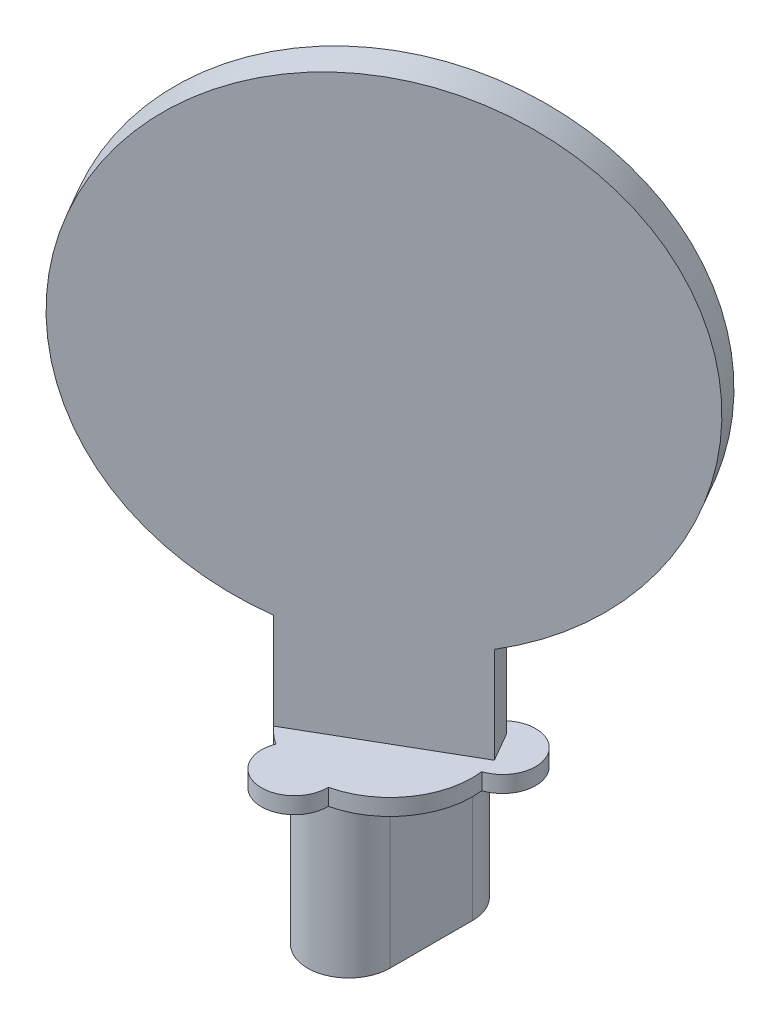
ISO-10303-21;
HEADER;
FILE_DESCRIPTION(('STEP AP214'),'2;1');
FILE_NAME('part.step','',(''),(''),'','','');
FILE_SCHEMA(('AUTOMOTIVE_DESIGN { 1 0 10303 214 1 1 1 1 }'));
ENDSEC;
DATA;
#1=APPLICATION_CONTEXT('core data for automotive mechanical design processes');
#2=APPLICATION_PROTOCOL_DEFINITION('international standard','automotive_design',2000,#1);
#3=PRODUCT_CONTEXT('',#1,'mechanical');
#4=PRODUCT('Part','Part','',(#3));
#5=PRODUCT_RELATED_PRODUCT_CATEGORY('part','',(#4));
#6=PRODUCT_DEFINITION_FORMATION('','',#4);
#7=PRODUCT_DEFINITION_CONTEXT('part definition',#1,'design');
#8=PRODUCT_DEFINITION('design','',#6,#7);
#9=PRODUCT_DEFINITION_SHAPE('','',#8);
#10=(LENGTH_UNIT() NAMED_UNIT(*) SI_UNIT(.MILLI.,.METRE.));
#11=(NAMED_UNIT(*) PLANE_ANGLE_UNIT() SI_UNIT($,.RADIAN.));
#12=(NAMED_UNIT(*) SI_UNIT($,.STERADIAN.) SOLID_ANGLE_UNIT());
#13=UNCERTAINTY_MEASURE_WITH_UNIT(LENGTH_MEASURE(1.E-05),#10,'distance_accuracy_value','');
#14=(GEOMETRIC_REPRESENTATION_CONTEXT(3) GLOBAL_UNCERTAINTY_ASSIGNED_CONTEXT((#13)) GLOBAL_UNIT_ASSIGNED_CONTEXT((#10,
#11,#12)) REPRESENTATION_CONTEXT('',''));
#15=CARTESIAN_POINT('',(0.,0.,0.));
#16=DIRECTION('',(0.,0.,1.));
#17=DIRECTION('',(1.,0.,0.));
#18=AXIS2_PLACEMENT_3D('',#15,#16,#17);
#19=CARTESIAN_POINT('',(0.,0.,-2.5));
#20=DIRECTION('',(0.,1.,0.));
#21=DIRECTION('',(0.,0.,1.));
#22=AXIS2_PLACEMENT_3D('',#19,#20,#21);
#23=PLANE('',#22);
#24=DIRECTION('',(-0.866025403784438,0.,0.5));
#25=VECTOR('',#24,1.);
#26=CARTESIAN_POINT('',(3.74264068711928,0.,-3.31551514656762));
#27=LINE('',#26,#25);
#28=CARTESIAN_POINT('',(3.74264068711928,0.,-3.31551514656762));
#29=VERTEX_POINT('',#28);
#30=CARTESIAN_POINT('',(-4.74264068711928,0.,1.58346433899874));
#31=VERTEX_POINT('',#30);
#32=EDGE_CURVE('E186',#29,#31,#27,.T.);
#33=ORIENTED_EDGE('',*,*,#32,.F.);
#34=DIRECTION('',(0.5,0.,0.866025403784439));
#35=VECTOR('',#34,1.);
#36=CARTESIAN_POINT('',(3.74264068711928,0.,-3.31551514656762));
#37=LINE('',#36,#35);
#38=CARTESIAN_POINT('',(4.74264068711929,0.,-1.58346433899874));
#39=VERTEX_POINT('',#38);
#40=EDGE_CURVE('E481',#29,#39,#37,.T.);
#41=ORIENTED_EDGE('',*,*,#40,.T.);
#42=DIRECTION('',(-0.866025403784439,0.,0.5));
#43=VECTOR('',#42,1.);
#44=CARTESIAN_POINT('',(4.74264068711929,0.,-1.58346433899874));
#45=LINE('',#44,#43);
#46=CARTESIAN_POINT('',(-3.74264068711928,0.,3.31551514656762));
#47=VERTEX_POINT('',#46);
#48=EDGE_CURVE('E202',#39,#47,#45,.T.);
#49=ORIENTED_EDGE('',*,*,#48,.T.);
#50=CARTESIAN_POINT('',(0.,0.,0.));
#51=DIRECTION('',(0.,1.,0.));
#52=DIRECTION('',(0.,0.,1.));
#53=AXIS2_PLACEMENT_3D('',#50,#51,#52);
#54=CIRCLE('',#53,5.);
#55=CARTESIAN_POINT('',(-2.72860280896128,0.,4.18983611981765));
#56=VERTEX_POINT('',#55);
#57=EDGE_CURVE('E199',#47,#56,#54,.T.);
#58=ORIENTED_EDGE('',*,*,#57,.T.);
#59=CARTESIAN_POINT('',(-0.86824088833465,0.,4.92403876506104));
#60=DIRECTION('',(0.,1.,0.));
#61=DIRECTION('',(0.,0.,1.));
#62=AXIS2_PLACEMENT_3D('',#59,#60,#61);
#63=CIRCLE('',#62,2.);
#64=CARTESIAN_POINT('',(1.13103957442552,0.,4.87039520789467));
#65=VERTEX_POINT('',#64);
#66=EDGE_CURVE('E216',#56,#65,#63,.T.);
#67=ORIENTED_EDGE('',*,*,#66,.T.);
#68=CARTESIAN_POINT('',(4.96351275452169,0.,-0.602943725152275));
#69=VERTEX_POINT('',#68);
#70=EDGE_CURVE('E193',#65,#69,#54,.T.);
#71=ORIENTED_EDGE('',*,*,#70,.T.);
#72=CARTESIAN_POINT('',(4.3301270189222,0.,-2.49999999999999));
#73=DIRECTION('',(0.,1.,0.));
#74=DIRECTION('',(0.,0.,1.));
#75=AXIS2_PLACEMENT_3D('',#72,#73,#74);
#76=CIRCLE('',#75,2.);
#77=CARTESIAN_POINT('',(3.00392096029516,0.,-3.99705627484771));
#78=VERTEX_POINT('',#77);
#79=EDGE_CURVE('E237',#69,#78,#76,.T.);
#80=ORIENTED_EDGE('',*,*,#79,.T.);
#81=CARTESIAN_POINT('',(-3.652366189294,0.,-3.41470660808539));
#82=VERTEX_POINT('',#81);
#83=EDGE_CURVE('E190',#78,#82,#54,.T.);
#84=ORIENTED_EDGE('',*,*,#83,.T.);
#85=CARTESIAN_POINT('',(-4.69846310392954,0.,-1.71010071662836));
#86=DIRECTION('',(0.,1.,0.));
#87=DIRECTION('',(0.,0.,1.));
#88=AXIS2_PLACEMENT_3D('',#85,#86,#87);
#89=CIRCLE('',#88,2.);
#90=CARTESIAN_POINT('',(-4.99280592193635,0.,0.268121289489207));
#91=VERTEX_POINT('',#90);
#92=EDGE_CURVE('E188',#82,#91,#89,.T.);
#93=ORIENTED_EDGE('',*,*,#92,.T.);
#94=EDGE_CURVE('E183',#91,#31,#54,.T.);
#95=ORIENTED_EDGE('',*,*,#94,.T.);
#96=EDGE_LOOP('',(#33,#41,#49,#58,#67,#71,#80,#84,#93,#95));
#97=FACE_BOUND('',#96,.T.);
#98=ADVANCED_FACE('F66',(#97),#23,.T.);
#99=CARTESIAN_POINT('',(0.,-10.,-2.5));
#100=DIRECTION('',(0.,1.,0.));
#101=DIRECTION('',(0.,0.,1.));
#102=AXIS2_PLACEMENT_3D('',#99,#100,#101);
#103=CYLINDRICAL_SURFACE('',#102,2.5);
#104=CARTESIAN_POINT('',(0.,-0.999999999999999,-2.5));
#105=DIRECTION('',(0.,1.,0.));
#106=DIRECTION('',(0.,0.,1.));
#107=AXIS2_PLACEMENT_3D('',#104,#105,#106);
#108=CIRCLE('',#107,2.5);
#109=CARTESIAN_POINT('',(-2.5,-0.999999999999999,-2.5));
#110=VERTEX_POINT('',#109);
#111=CARTESIAN_POINT('',(0.,-1.,-5.));
#112=VERTEX_POINT('',#111);
#113=EDGE_CURVE('E253',#110,#112,#108,.F.);
#114=ORIENTED_EDGE('',*,*,#113,.T.);
#115=CARTESIAN_POINT('',(2.5,-0.999999999999999,-2.5));
#116=VERTEX_POINT('',#115);
#117=EDGE_CURVE('E256',#112,#116,#108,.F.);
#118=ORIENTED_EDGE('',*,*,#117,.T.);
#119=DIRECTION('',(0.,1.,0.));
#120=VECTOR('',#119,1.);
#121=CARTESIAN_POINT('',(2.5,-10.,-2.5));
#122=LINE('',#121,#120);
#123=CARTESIAN_POINT('',(2.5,-10.,-2.5));
#124=VERTEX_POINT('',#123);
#125=EDGE_CURVE('E74',#124,#116,#122,.T.);
#126=ORIENTED_EDGE('',*,*,#125,.F.);
#127=CARTESIAN_POINT('',(0.,-10.,-2.5));
#128=DIRECTION('',(0.,1.,0.));
#129=DIRECTION('',(0.,0.,1.));
#130=AXIS2_PLACEMENT_3D('',#127,#128,#129);
#131=CIRCLE('',#130,2.5);
#132=CARTESIAN_POINT('',(-2.5,-10.,-2.5));
#133=VERTEX_POINT('',#132);
#134=EDGE_CURVE('E257',#124,#133,#131,.T.);
#135=ORIENTED_EDGE('',*,*,#134,.T.);
#136=DIRECTION('',(0.,1.,0.));
#137=VECTOR('',#136,1.);
#138=CARTESIAN_POINT('',(-2.5,-10.,-2.5));
#139=LINE('',#138,#137);
#140=EDGE_CURVE('E268',#133,#110,#139,.T.);
#141=ORIENTED_EDGE('',*,*,#140,.T.);
#142=EDGE_LOOP('',(#114,#118,#126,#135,#141));
#143=FACE_BOUND('',#142,.T.);
#144=ADVANCED_FACE('F68',(#143),#103,.T.);
#145=CARTESIAN_POINT('',(2.5,-10.,-2.5));
#146=DIRECTION('',(-1.,0.,0.));
#147=DIRECTION('',(0.,0.,1.));
#148=AXIS2_PLACEMENT_3D('',#145,#146,#147);
#149=PLANE('',#148);
#150=DIRECTION('',(0.,0.,-1.));
#151=VECTOR('',#150,1.);
#152=CARTESIAN_POINT('',(2.5,-0.999999999999999,-2.5));
#153=LINE('',#152,#151);
#154=CARTESIAN_POINT('',(2.50000000000001,-0.999999999999999,2.5));
#155=VERTEX_POINT('',#154);
#156=EDGE_CURVE('E251',#155,#116,#153,.T.);
#157=ORIENTED_EDGE('',*,*,#156,.F.);
#158=DIRECTION('',(0.,1.,0.));
#159=VECTOR('',#158,1.);
#160=CARTESIAN_POINT('',(2.50000000000001,-10.,2.5));
#161=LINE('',#160,#159);
#162=CARTESIAN_POINT('',(2.50000000000001,-10.,2.5));
#163=VERTEX_POINT('',#162);
#164=EDGE_CURVE('E271',#163,#155,#161,.T.);
#165=ORIENTED_EDGE('',*,*,#164,.F.);
#166=DIRECTION('',(0.,0.,1.));
#167=VECTOR('',#166,1.);
#168=CARTESIAN_POINT('',(2.5,-10.,-2.5));
#169=LINE('',#168,#167);
#170=EDGE_CURVE('E266',#124,#163,#169,.T.);
#171=ORIENTED_EDGE('',*,*,#170,.F.);
#172=ORIENTED_EDGE('',*,*,#125,.T.);
#173=EDGE_LOOP('',(#157,#165,#171,#172));
#174=FACE_BOUND('',#173,.T.);
#175=ADVANCED_FACE('F294',(#174),#149,.F.);
#176=CARTESIAN_POINT('',(0.,-10.,2.5));
#177=DIRECTION('',(0.,1.,0.));
#178=DIRECTION('',(0.,0.,1.));
#179=AXIS2_PLACEMENT_3D('',#176,#177,#178);
#180=CYLINDRICAL_SURFACE('',#179,2.5);
#181=ORIENTED_EDGE('',*,*,#164,.T.);
#182=CARTESIAN_POINT('',(0.,-0.999999999999999,2.5));
#183=DIRECTION('',(0.,1.,0.));
#184=DIRECTION('',(0.,0.,1.));
#185=AXIS2_PLACEMENT_3D('',#182,#183,#184);
#186=CIRCLE('',#185,2.5);
#187=CARTESIAN_POINT('',(-2.5,-0.999999999999999,2.5));
#188=VERTEX_POINT('',#187);
#189=EDGE_CURVE('E222',#155,#188,#186,.F.);
#190=ORIENTED_EDGE('',*,*,#189,.T.);
#191=DIRECTION('',(0.,1.,0.));
#192=VECTOR('',#191,1.);
#193=CARTESIAN_POINT('',(-2.5,-10.,2.5));
#194=LINE('',#193,#192);
#195=CARTESIAN_POINT('',(-2.5,-10.,2.5));
#196=VERTEX_POINT('',#195);
#197=EDGE_CURVE('E274',#196,#188,#194,.T.);
#198=ORIENTED_EDGE('',*,*,#197,.F.);
#199=CARTESIAN_POINT('',(0.,-10.,2.5));
#200=DIRECTION('',(0.,1.,0.));
#201=DIRECTION('',(0.,0.,1.));
#202=AXIS2_PLACEMENT_3D('',#199,#200,#201);
#203=CIRCLE('',#202,2.5);
#204=EDGE_CURVE('E263',#196,#163,#203,.T.);
#205=ORIENTED_EDGE('',*,*,#204,.T.);
#206=EDGE_LOOP('',(#181,#190,#198,#205));
#207=FACE_BOUND('',#206,.T.);
#208=ADVANCED_FACE('F289',(#207),#180,.T.);
#209=CARTESIAN_POINT('',(-2.5,-10.,-2.5));
#210=DIRECTION('',(-1.,0.,0.));
#211=DIRECTION('',(0.,0.,1.));
#212=AXIS2_PLACEMENT_3D('',#209,#210,#211);
#213=PLANE('',#212);
#214=ORIENTED_EDGE('',*,*,#197,.T.);
#215=DIRECTION('',(0.,0.,-1.));
#216=VECTOR('',#215,1.);
#217=CARTESIAN_POINT('',(-2.5,-0.999999999999999,-2.5));
#218=LINE('',#217,#216);
#219=EDGE_CURVE('E12',#188,#110,#218,.T.);
#220=ORIENTED_EDGE('',*,*,#219,.T.);
#221=ORIENTED_EDGE('',*,*,#140,.F.);
#222=DIRECTION('',(0.,0.,1.));
#223=VECTOR('',#222,1.);
#224=CARTESIAN_POINT('',(-2.5,-10.,-2.5));
#225=LINE('',#224,#223);
#226=EDGE_CURVE('E260',#133,#196,#225,.T.);
#227=ORIENTED_EDGE('',*,*,#226,.T.);
#228=EDGE_LOOP('',(#214,#220,#221,#227));
#229=FACE_BOUND('',#228,.T.);
#230=ADVANCED_FACE('F282',(#229),#213,.T.);
#231=CARTESIAN_POINT('',(0.,-10.,-2.5));
#232=DIRECTION('',(0.,1.,0.));
#233=DIRECTION('',(0.,0.,1.));
#234=AXIS2_PLACEMENT_3D('',#231,#232,#233);
#235=PLANE('',#234);
#236=ORIENTED_EDGE('',*,*,#134,.F.);
#237=ORIENTED_EDGE('',*,*,#170,.T.);
#238=ORIENTED_EDGE('',*,*,#204,.F.);
#239=ORIENTED_EDGE('',*,*,#226,.F.);
#240=EDGE_LOOP('',(#236,#237,#238,#239));
#241=FACE_BOUND('',#240,.T.);
#242=ADVANCED_FACE('F285',(#241),#235,.F.);
#243=CARTESIAN_POINT('',(0.,-1.,0.));
#244=DIRECTION('',(0.,1.,0.));
#245=DIRECTION('',(0.,0.,1.));
#246=AXIS2_PLACEMENT_3D('',#243,#244,#245);
#247=CYLINDRICAL_SURFACE('',#246,5.);
#248=DIRECTION('',(0.,1.,0.));
#249=VECTOR('',#248,1.);
#250=CARTESIAN_POINT('',(-3.652366189294,-1.,-3.41470660808539));
#251=LINE('',#250,#249);
#252=CARTESIAN_POINT('',(-3.652366189294,-1.,-3.41470660808539));
#253=VERTEX_POINT('',#252);
#254=EDGE_CURVE('E227',#253,#82,#251,.T.);
#255=ORIENTED_EDGE('',*,*,#254,.T.);
#256=ORIENTED_EDGE('',*,*,#83,.F.);
#257=DIRECTION('',(0.,1.,0.));
#258=VECTOR('',#257,1.);
#259=CARTESIAN_POINT('',(3.00392096029516,-1.,-3.99705627484771));
#260=LINE('',#259,#258);
#261=CARTESIAN_POINT('',(3.00392096029516,-1.,-3.99705627484771));
#262=VERTEX_POINT('',#261);
#263=EDGE_CURVE('E229',#262,#78,#260,.T.);
#264=ORIENTED_EDGE('',*,*,#263,.F.);
#265=CARTESIAN_POINT('',(0.,-1.,0.));
#266=DIRECTION('',(0.,1.,0.));
#267=DIRECTION('',(0.,0.,1.));
#268=AXIS2_PLACEMENT_3D('',#265,#266,#267);
#269=CIRCLE('',#268,5.);
#270=EDGE_CURVE('E240',#262,#112,#269,.T.);
#271=ORIENTED_EDGE('',*,*,#270,.T.);
#272=EDGE_CURVE('E245',#112,#253,#269,.T.);
#273=ORIENTED_EDGE('',*,*,#272,.T.);
#274=EDGE_LOOP('',(#255,#256,#264,#271,#273));
#275=FACE_BOUND('',#274,.T.);
#276=ADVANCED_FACE('F302',(#275),#247,.T.);
#277=CARTESIAN_POINT('',(-0.86824088833465,-1.,4.92403876506104));
#278=DIRECTION('',(0.,1.,0.));
#279=DIRECTION('',(0.,0.,1.));
#280=AXIS2_PLACEMENT_3D('',#277,#278,#279);
#281=CYLINDRICAL_SURFACE('',#280,2.);
#282=ORIENTED_EDGE('',*,*,#66,.F.);
#283=DIRECTION('',(0.,1.,0.));
#284=VECTOR('',#283,1.);
#285=CARTESIAN_POINT('',(-2.72860280896128,-1.,4.18983611981765));
#286=LINE('',#285,#284);
#287=CARTESIAN_POINT('',(-2.72860280896128,-1.,4.18983611981765));
#288=VERTEX_POINT('',#287);
#289=EDGE_CURVE('E215',#288,#56,#286,.T.);
#290=ORIENTED_EDGE('',*,*,#289,.F.);
#291=CARTESIAN_POINT('',(-0.86824088833465,-1.,4.92403876506104));
#292=DIRECTION('',(0.,1.,0.));
#293=DIRECTION('',(0.,0.,1.));
#294=AXIS2_PLACEMENT_3D('',#291,#292,#293);
#295=CIRCLE('',#294,2.);
#296=CARTESIAN_POINT('',(1.13103957442552,-1.,4.87039520789467));
#297=VERTEX_POINT('',#296);
#298=EDGE_CURVE('E212',#288,#297,#295,.T.);
#299=ORIENTED_EDGE('',*,*,#298,.T.);
#300=DIRECTION('',(0.,1.,0.));
#301=VECTOR('',#300,1.);
#302=CARTESIAN_POINT('',(1.13103957442552,-1.,4.87039520789467));
#303=LINE('',#302,#301);
#304=EDGE_CURVE('E220',#297,#65,#303,.T.);
#305=ORIENTED_EDGE('',*,*,#304,.T.);
#306=EDGE_LOOP('',(#282,#290,#299,#305));
#307=FACE_BOUND('',#306,.T.);
#308=ADVANCED_FACE('F313',(#307),#281,.T.);
#309=CARTESIAN_POINT('',(0.,-1.,0.));
#310=DIRECTION('',(0.,1.,0.));
#311=DIRECTION('',(0.,0.,1.));
#312=AXIS2_PLACEMENT_3D('',#309,#310,#311);
#313=PLANE('',#312);
#314=ORIENTED_EDGE('',*,*,#117,.F.);
#315=ORIENTED_EDGE('',*,*,#270,.F.);
#316=CARTESIAN_POINT('',(4.3301270189222,-1.,-2.49999999999999));
#317=DIRECTION('',(0.,1.,0.));
#318=DIRECTION('',(0.,0.,1.));
#319=AXIS2_PLACEMENT_3D('',#316,#317,#318);
#320=CIRCLE('',#319,2.);
#321=CARTESIAN_POINT('',(4.96351275452169,-1.,-0.602943725152275));
#322=VERTEX_POINT('',#321);
#323=EDGE_CURVE('E233',#322,#262,#320,.T.);
#324=ORIENTED_EDGE('',*,*,#323,.F.);
#325=EDGE_CURVE('E248',#297,#322,#269,.T.);
#326=ORIENTED_EDGE('',*,*,#325,.F.);
#327=ORIENTED_EDGE('',*,*,#298,.F.);
#328=CARTESIAN_POINT('',(-4.99280592193635,-1.,0.268121289489207));
#329=VERTEX_POINT('',#328);
#330=EDGE_CURVE('E246',#329,#288,#269,.T.);
#331=ORIENTED_EDGE('',*,*,#330,.F.);
#332=CARTESIAN_POINT('',(-4.69846310392954,-1.,-1.71010071662836));
#333=DIRECTION('',(0.,1.,0.));
#334=DIRECTION('',(0.,0.,1.));
#335=AXIS2_PLACEMENT_3D('',#332,#333,#334);
#336=CIRCLE('',#335,2.);
#337=EDGE_CURVE('E224',#253,#329,#336,.T.);
#338=ORIENTED_EDGE('',*,*,#337,.F.);
#339=ORIENTED_EDGE('',*,*,#272,.F.);
#340=ORIENTED_EDGE('',*,*,#113,.F.);
#341=ORIENTED_EDGE('',*,*,#219,.F.);
#342=ORIENTED_EDGE('',*,*,#189,.F.);
#343=ORIENTED_EDGE('',*,*,#156,.T.);
#344=EDGE_LOOP('',(#314,#315,#324,#326,#327,#331,#338,#339,#340,#341,#342,#343));
#345=FACE_BOUND('',#344,.T.);
#346=ADVANCED_FACE('F292',(#345),#313,.F.);
#347=CARTESIAN_POINT('',(-4.69846310392954,-1.,-1.71010071662836));
#348=DIRECTION('',(0.,1.,0.));
#349=DIRECTION('',(0.,0.,1.));
#350=AXIS2_PLACEMENT_3D('',#347,#348,#349);
#351=CYLINDRICAL_SURFACE('',#350,2.);
#352=ORIENTED_EDGE('',*,*,#92,.F.);
#353=ORIENTED_EDGE('',*,*,#254,.F.);
#354=ORIENTED_EDGE('',*,*,#337,.T.);
#355=DIRECTION('',(0.,1.,0.));
#356=VECTOR('',#355,1.);
#357=CARTESIAN_POINT('',(-4.99280592193635,-1.,0.268121289489207));
#358=LINE('',#357,#356);
#359=EDGE_CURVE('E219',#329,#91,#358,.T.);
#360=ORIENTED_EDGE('',*,*,#359,.T.);
#361=EDGE_LOOP('',(#352,#353,#354,#360));
#362=FACE_BOUND('',#361,.T.);
#363=ADVANCED_FACE('F316',(#362),#351,.T.);
#364=CARTESIAN_POINT('',(4.3301270189222,-1.,-2.49999999999999));
#365=DIRECTION('',(0.,1.,0.));
#366=DIRECTION('',(0.,0.,1.));
#367=AXIS2_PLACEMENT_3D('',#364,#365,#366);
#368=CYLINDRICAL_SURFACE('',#367,2.);
#369=ORIENTED_EDGE('',*,*,#79,.F.);
#370=DIRECTION('',(0.,1.,0.));
#371=VECTOR('',#370,1.);
#372=CARTESIAN_POINT('',(4.96351275452169,-1.,-0.602943725152275));
#373=LINE('',#372,#371);
#374=EDGE_CURVE('E236',#322,#69,#373,.T.);
#375=ORIENTED_EDGE('',*,*,#374,.F.);
#376=ORIENTED_EDGE('',*,*,#323,.T.);
#377=ORIENTED_EDGE('',*,*,#263,.T.);
#378=EDGE_LOOP('',(#369,#375,#376,#377));
#379=FACE_BOUND('',#378,.T.);
#380=ADVANCED_FACE('F306',(#379),#368,.T.);
#381=ORIENTED_EDGE('',*,*,#70,.F.);
#382=ORIENTED_EDGE('',*,*,#304,.F.);
#383=ORIENTED_EDGE('',*,*,#325,.T.);
#384=ORIENTED_EDGE('',*,*,#374,.T.);
#385=EDGE_LOOP('',(#381,#382,#383,#384));
#386=FACE_BOUND('',#385,.T.);
#387=ADVANCED_FACE('F323',(#386),#247,.T.);
#388=ORIENTED_EDGE('',*,*,#330,.T.);
#389=ORIENTED_EDGE('',*,*,#289,.T.);
#390=ORIENTED_EDGE('',*,*,#57,.F.);
#391=EDGE_CURVE('E191',#31,#47,#54,.T.);
#392=ORIENTED_EDGE('',*,*,#391,.F.);
#393=ORIENTED_EDGE('',*,*,#94,.F.);
#394=ORIENTED_EDGE('',*,*,#359,.F.);
#395=EDGE_LOOP('',(#388,#389,#390,#392,#393,#394));
#396=FACE_BOUND('',#395,.T.);
#397=ADVANCED_FACE('F197',(#396),#247,.T.);
#398=DIRECTION('',(0.5,0.,0.866025403784439));
#399=VECTOR('',#398,1.);
#400=CARTESIAN_POINT('',(-4.74264068711928,0.,1.58346433899874));
#401=LINE('',#400,#399);
#402=EDGE_CURVE('E172',#31,#47,#401,.T.);
#403=ORIENTED_EDGE('',*,*,#402,.F.);
#404=ORIENTED_EDGE('',*,*,#391,.T.);
#405=EDGE_LOOP('',(#403,#404));
#406=FACE_BOUND('',#405,.T.);
#407=ADVANCED_FACE('F201',(#406),#23,.T.);
#408=CARTESIAN_POINT('',(3.74264068711928,20.,-3.31551514656762));
#409=DIRECTION('',(0.866025403784438,0.,-0.5));
#410=DIRECTION('',(-0.5,0.,-0.866025403784439));
#411=AXIS2_PLACEMENT_3D('',#408,#409,#410);
#412=PLANE('',#411);
#413=DIRECTION('',(-0.5,0.,-0.866025403784438));
#414=VECTOR('',#413,1.);
#415=CARTESIAN_POINT('',(4.74264068711928,5.82255312124218,-1.58346433899874));
#416=LINE('',#415,#414);
#417=CARTESIAN_POINT('',(4.74264068711929,5.82255312124218,-1.58346433899874));
#418=VERTEX_POINT('',#417);
#419=CARTESIAN_POINT('',(3.74264068711928,5.82255312124218,-3.31551514656762));
#420=VERTEX_POINT('',#419);
#421=EDGE_CURVE('E473',#418,#420,#416,.T.);
#422=ORIENTED_EDGE('',*,*,#421,.F.);
#423=DIRECTION('',(0.,-1.,0.));
#424=VECTOR('',#423,1.);
#425=CARTESIAN_POINT('',(4.74264068711929,20.,-1.58346433899874));
#426=LINE('',#425,#424);
#427=EDGE_CURVE('E205',#418,#39,#426,.T.);
#428=ORIENTED_EDGE('',*,*,#427,.T.);
#429=ORIENTED_EDGE('',*,*,#40,.F.);
#430=DIRECTION('',(0.,-1.,0.));
#431=VECTOR('',#430,1.);
#432=CARTESIAN_POINT('',(3.74264068711928,20.,-3.31551514656762));
#433=LINE('',#432,#431);
#434=EDGE_CURVE('E81',#420,#29,#433,.T.);
#435=ORIENTED_EDGE('',*,*,#434,.F.);
#436=EDGE_LOOP('',(#422,#428,#429,#435));
#437=FACE_BOUND('',#436,.T.);
#438=ADVANCED_FACE('F336',(#437),#412,.T.);
#439=CARTESIAN_POINT('',(3.74264068711928,20.,-3.31551514656762));
#440=DIRECTION('',(0.5,0.,0.866025403784438));
#441=DIRECTION('',(0.866025403784439,0.,-0.5));
#442=AXIS2_PLACEMENT_3D('',#439,#440,#441);
#443=PLANE('',#442);
#444=CARTESIAN_POINT('',(-0.500000000000001,20.,-0.866025403784442));
#445=DIRECTION('',(-0.5,0.,-0.866025403784438));
#446=DIRECTION('',(-0.866025403784439,0.,0.5));
#447=AXIS2_PLACEMENT_3D('',#444,#445,#446);
#448=CIRCLE('',#447,15.);
#449=CARTESIAN_POINT('',(-4.74264068711928,5.82255312124218,1.58346433899874));
#450=VERTEX_POINT('',#449);
#451=EDGE_CURVE('E475',#450,#420,#448,.T.);
#452=ORIENTED_EDGE('',*,*,#451,.T.);
#453=ORIENTED_EDGE('',*,*,#434,.T.);
#454=ORIENTED_EDGE('',*,*,#32,.T.);
#455=DIRECTION('',(0.,-1.,0.));
#456=VECTOR('',#455,1.);
#457=CARTESIAN_POINT('',(-4.74264068711928,20.,1.58346433899874));
#458=LINE('',#457,#456);
#459=EDGE_CURVE('E168',#450,#31,#458,.T.);
#460=ORIENTED_EDGE('',*,*,#459,.F.);
#461=EDGE_LOOP('',(#452,#453,#454,#460));
#462=FACE_BOUND('',#461,.T.);
#463=ADVANCED_FACE('F204',(#462),#443,.F.);
#464=CARTESIAN_POINT('',(-4.74264068711928,20.,1.58346433899874));
#465=DIRECTION('',(0.866025403784439,0.,-0.5));
#466=DIRECTION('',(-0.5,0.,-0.866025403784439));
#467=AXIS2_PLACEMENT_3D('',#464,#465,#466);
#468=PLANE('',#467);
#469=DIRECTION('',(0.,-1.,0.));
#470=VECTOR('',#469,1.);
#471=CARTESIAN_POINT('',(-3.74264068711928,20.,3.31551514656761));
#472=LINE('',#471,#470);
#473=CARTESIAN_POINT('',(-3.74264068711929,5.82255312124218,3.31551514656761));
#474=VERTEX_POINT('',#473);
#475=EDGE_CURVE('E177',#474,#47,#472,.T.);
#476=ORIENTED_EDGE('',*,*,#475,.F.);
#477=DIRECTION('',(-0.5,0.,-0.866025403784438));
#478=VECTOR('',#477,1.);
#479=CARTESIAN_POINT('',(-3.74264068711929,5.82255312124218,3.31551514656761));
#480=LINE('',#479,#478);
#481=EDGE_CURVE('E89',#474,#450,#480,.T.);
#482=ORIENTED_EDGE('',*,*,#481,.T.);
#483=ORIENTED_EDGE('',*,*,#459,.T.);
#484=ORIENTED_EDGE('',*,*,#402,.T.);
#485=EDGE_LOOP('',(#476,#482,#483,#484));
#486=FACE_BOUND('',#485,.T.);
#487=ADVANCED_FACE('F170',(#486),#468,.F.);
#488=CARTESIAN_POINT('',(4.74264068711929,20.,-1.58346433899874));
#489=DIRECTION('',(0.5,0.,0.866025403784439));
#490=DIRECTION('',(0.866025403784439,0.,-0.5));
#491=AXIS2_PLACEMENT_3D('',#488,#489,#490);
#492=PLANE('',#491);
#493=ORIENTED_EDGE('',*,*,#427,.F.);
#494=CARTESIAN_POINT('',(0.499999999999999,20.,0.866025403784435));
#495=DIRECTION('',(-0.5,0.,-0.866025403784438));
#496=DIRECTION('',(-0.866025403784439,0.,0.5));
#497=AXIS2_PLACEMENT_3D('',#494,#495,#496);
#498=CIRCLE('',#497,15.);
#499=EDGE_CURVE('E472',#474,#418,#498,.T.);
#500=ORIENTED_EDGE('',*,*,#499,.F.);
#501=ORIENTED_EDGE('',*,*,#475,.T.);
#502=ORIENTED_EDGE('',*,*,#48,.F.);
#503=EDGE_LOOP('',(#493,#500,#501,#502));
#504=FACE_BOUND('',#503,.T.);
#505=ADVANCED_FACE('F448',(#504),#492,.T.);
#506=CARTESIAN_POINT('',(0.499999999999999,20.,0.866025403784435));
#507=DIRECTION('',(-0.5,0.,-0.866025403784438));
#508=DIRECTION('',(-0.866025403784439,0.,0.5));
#509=AXIS2_PLACEMENT_3D('',#506,#507,#508);
#510=CYLINDRICAL_SURFACE('',#509,15.);
#511=ORIENTED_EDGE('',*,*,#499,.T.);
#512=ORIENTED_EDGE('',*,*,#421,.T.);
#513=ORIENTED_EDGE('',*,*,#451,.F.);
#514=ORIENTED_EDGE('',*,*,#481,.F.);
#515=EDGE_LOOP('',(#511,#512,#513,#514));
#516=FACE_BOUND('',#515,.T.);
#517=ADVANCED_FACE('F456',(#516),#510,.T.);
#518=CLOSED_SHELL('',(#98,#144,#175,#208,#230,#242,#276,#308,#346,#363,#380,#387,#397,#407,#438,
#463,#487,#505,#517));
#519=MANIFOLD_SOLID_BREP('B2',#518);
#520=ADVANCED_BREP_SHAPE_REPRESENTATION('',(#18,#519),#14);
#521=SHAPE_DEFINITION_REPRESENTATION(#9,#520);
ENDSEC;
END-ISO-10303-21;
